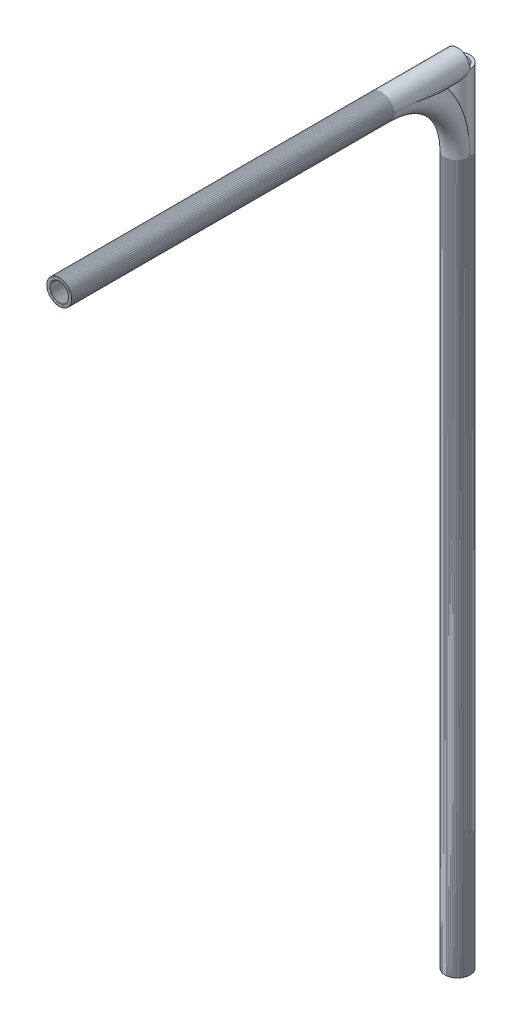
ISO-10303-21;
HEADER;
FILE_DESCRIPTION(('STEP AP214'),'2;1');
FILE_NAME('part.step','',(''),(''),'','','');
FILE_SCHEMA(('AUTOMOTIVE_DESIGN { 1 0 10303 214 1 1 1 1 }'));
ENDSEC;
DATA;
#1=APPLICATION_CONTEXT('core data for automotive mechanical design processes');
#2=APPLICATION_PROTOCOL_DEFINITION('international standard','automotive_design',2000,#1);
#3=PRODUCT_CONTEXT('',#1,'mechanical');
#4=PRODUCT('Part','Part','',(#3));
#5=PRODUCT_RELATED_PRODUCT_CATEGORY('part','',(#4));
#6=PRODUCT_DEFINITION_FORMATION('','',#4);
#7=PRODUCT_DEFINITION_CONTEXT('part definition',#1,'design');
#8=PRODUCT_DEFINITION('design','',#6,#7);
#9=PRODUCT_DEFINITION_SHAPE('','',#8);
#10=(LENGTH_UNIT() NAMED_UNIT(*) SI_UNIT(.MILLI.,.METRE.));
#11=(NAMED_UNIT(*) PLANE_ANGLE_UNIT() SI_UNIT($,.RADIAN.));
#12=(NAMED_UNIT(*) SI_UNIT($,.STERADIAN.) SOLID_ANGLE_UNIT());
#13=UNCERTAINTY_MEASURE_WITH_UNIT(LENGTH_MEASURE(1.E-05),#10,'distance_accuracy_value','');
#14=(GEOMETRIC_REPRESENTATION_CONTEXT(3) GLOBAL_UNCERTAINTY_ASSIGNED_CONTEXT((#13)) GLOBAL_UNIT_ASSIGNED_CONTEXT((#10,
#11,#12)) REPRESENTATION_CONTEXT('',''));
#15=CARTESIAN_POINT('',(0.,0.,0.));
#16=DIRECTION('',(0.,0.,1.));
#17=DIRECTION('',(1.,0.,0.));
#18=AXIS2_PLACEMENT_3D('',#15,#16,#17);
#19=CARTESIAN_POINT('',(0.,-256.,-150.));
#20=DIRECTION('',(0.,1.,0.));
#21=DIRECTION('',(0.,0.,1.));
#22=AXIS2_PLACEMENT_3D('',#19,#20,#21);
#23=PLANE('',#22);
#24=CARTESIAN_POINT('',(0.,-256.,-150.));
#25=DIRECTION('',(0.,1.,0.));
#26=DIRECTION('',(0.,0.,1.));
#27=AXIS2_PLACEMENT_3D('',#24,#25,#26);
#28=CIRCLE('',#27,3.065);
#29=CARTESIAN_POINT('',(0.,-256.,-146.935));
#30=VERTEX_POINT('',#29);
#31=EDGE_CURVE('E88',#30,#30,#28,.T.);
#32=ORIENTED_EDGE('',*,*,#31,.T.);
#33=EDGE_LOOP('',(#32));
#34=FACE_BOUND('',#33,.T.);
#35=CARTESIAN_POINT('',(0.,-256.,-150.));
#36=DIRECTION('',(0.,1.,0.));
#37=DIRECTION('',(0.,0.,1.));
#38=AXIS2_PLACEMENT_3D('',#35,#36,#37);
#39=CIRCLE('',#38,4.065);
#40=CARTESIAN_POINT('',(0.,-256.,-145.935));
#41=VERTEX_POINT('',#40);
#42=EDGE_CURVE('E80',#41,#41,#39,.T.);
#43=ORIENTED_EDGE('',*,*,#42,.F.);
#44=EDGE_LOOP('',(#43));
#45=FACE_BOUND('',#44,.T.);
#46=ADVANCED_FACE('F74',(#34,#45),#23,.F.);
#47=CARTESIAN_POINT('',(0.,0.,-150.));
#48=DIRECTION('',(0.,1.,0.));
#49=DIRECTION('',(0.,0.,1.));
#50=AXIS2_PLACEMENT_3D('',#47,#48,#49);
#51=PLANE('',#50);
#52=CARTESIAN_POINT('',(0.,0.,-150.));
#53=DIRECTION('',(0.,1.,0.));
#54=DIRECTION('',(0.,0.,1.));
#55=AXIS2_PLACEMENT_3D('',#52,#53,#54);
#56=CIRCLE('',#55,3.065);
#57=CARTESIAN_POINT('',(0.,0.,-146.935));
#58=VERTEX_POINT('',#57);
#59=EDGE_CURVE('E84',#58,#58,#56,.T.);
#60=ORIENTED_EDGE('',*,*,#59,.F.);
#61=EDGE_LOOP('',(#60));
#62=FACE_BOUND('',#61,.T.);
#63=CARTESIAN_POINT('',(0.,0.,-150.));
#64=DIRECTION('',(0.,1.,0.));
#65=DIRECTION('',(0.,0.,1.));
#66=AXIS2_PLACEMENT_3D('',#63,#64,#65);
#67=CIRCLE('',#66,4.065);
#68=CARTESIAN_POINT('',(0.,0.,-145.935));
#69=VERTEX_POINT('',#68);
#70=EDGE_CURVE('E12',#69,#69,#67,.T.);
#71=ORIENTED_EDGE('',*,*,#70,.T.);
#72=EDGE_LOOP('',(#71));
#73=FACE_BOUND('',#72,.T.);
#74=ADVANCED_FACE('F104',(#62,#73),#51,.T.);
#75=CARTESIAN_POINT('',(0.,-256.,-150.));
#76=DIRECTION('',(0.,1.,0.));
#77=DIRECTION('',(0.,0.,1.));
#78=AXIS2_PLACEMENT_3D('',#75,#76,#77);
#79=CYLINDRICAL_SURFACE('',#78,4.065);
#80=ORIENTED_EDGE('',*,*,#70,.F.);
#81=EDGE_LOOP('',(#80));
#82=FACE_BOUND('',#81,.T.);
#83=ORIENTED_EDGE('',*,*,#42,.T.);
#84=EDGE_LOOP('',(#83));
#85=FACE_BOUND('',#84,.T.);
#86=ADVANCED_FACE('F98',(#82,#85),#79,.T.);
#87=CARTESIAN_POINT('',(0.,-256.,-150.));
#88=DIRECTION('',(0.,1.,0.));
#89=DIRECTION('',(0.,0.,1.));
#90=AXIS2_PLACEMENT_3D('',#87,#88,#89);
#91=CYLINDRICAL_SURFACE('',#90,3.065);
#92=ORIENTED_EDGE('',*,*,#59,.T.);
#93=EDGE_LOOP('',(#92));
#94=FACE_BOUND('',#93,.T.);
#95=ORIENTED_EDGE('',*,*,#31,.F.);
#96=EDGE_LOOP('',(#95));
#97=FACE_BOUND('',#96,.T.);
#98=ADVANCED_FACE('F96',(#94,#97),#91,.F.);
#99=CLOSED_SHELL('',(#46,#74,#86,#98));
#100=MANIFOLD_SOLID_BREP('B2',#99);
#101=CARTESIAN_POINT('',(0.,0.,-20.));
#102=DIRECTION('',(0.,0.,-1.));
#103=DIRECTION('',(-1.,0.,0.));
#104=AXIS2_PLACEMENT_3D('',#101,#102,#103);
#105=PLANE('',#104);
#106=CARTESIAN_POINT('',(0.,0.,-20.));
#107=DIRECTION('',(0.,0.,-1.));
#108=DIRECTION('',(-1.,0.,0.));
#109=AXIS2_PLACEMENT_3D('',#106,#107,#108);
#110=CIRCLE('',#109,3.065);
#111=CARTESIAN_POINT('',(-3.065,0.,-20.));
#112=VERTEX_POINT('',#111);
#113=EDGE_CURVE('E157',#112,#112,#110,.T.);
#114=ORIENTED_EDGE('',*,*,#113,.T.);
#115=EDGE_LOOP('',(#114));
#116=FACE_BOUND('',#115,.T.);
#117=CARTESIAN_POINT('',(0.,0.,-20.));
#118=DIRECTION('',(0.,0.,-1.));
#119=DIRECTION('',(-1.,0.,0.));
#120=AXIS2_PLACEMENT_3D('',#117,#118,#119);
#121=CIRCLE('',#120,4.065);
#122=CARTESIAN_POINT('',(-4.065,0.,-20.));
#123=VERTEX_POINT('',#122);
#124=EDGE_CURVE('E149',#123,#123,#121,.T.);
#125=ORIENTED_EDGE('',*,*,#124,.F.);
#126=EDGE_LOOP('',(#125));
#127=FACE_BOUND('',#126,.T.);
#128=ADVANCED_FACE('F143',(#116,#127),#105,.F.);
#129=CARTESIAN_POINT('',(0.,0.,-150.));
#130=DIRECTION('',(0.,0.,-1.));
#131=DIRECTION('',(-1.,0.,0.));
#132=AXIS2_PLACEMENT_3D('',#129,#130,#131);
#133=PLANE('',#132);
#134=CARTESIAN_POINT('',(0.,0.,-150.));
#135=DIRECTION('',(0.,0.,-1.));
#136=DIRECTION('',(-1.,0.,0.));
#137=AXIS2_PLACEMENT_3D('',#134,#135,#136);
#138=CIRCLE('',#137,3.065);
#139=CARTESIAN_POINT('',(-3.065,0.,-150.));
#140=VERTEX_POINT('',#139);
#141=EDGE_CURVE('E153',#140,#140,#138,.T.);
#142=ORIENTED_EDGE('',*,*,#141,.F.);
#143=EDGE_LOOP('',(#142));
#144=FACE_BOUND('',#143,.T.);
#145=CARTESIAN_POINT('',(0.,0.,-150.));
#146=DIRECTION('',(0.,0.,-1.));
#147=DIRECTION('',(-1.,0.,0.));
#148=AXIS2_PLACEMENT_3D('',#145,#146,#147);
#149=CIRCLE('',#148,4.065);
#150=CARTESIAN_POINT('',(-4.065,0.,-150.));
#151=VERTEX_POINT('',#150);
#152=EDGE_CURVE('E73',#151,#151,#149,.T.);
#153=ORIENTED_EDGE('',*,*,#152,.T.);
#154=EDGE_LOOP('',(#153));
#155=FACE_BOUND('',#154,.T.);
#156=ADVANCED_FACE('F173',(#144,#155),#133,.T.);
#157=CARTESIAN_POINT('',(0.,0.,-20.));
#158=DIRECTION('',(0.,0.,-1.));
#159=DIRECTION('',(-1.,0.,0.));
#160=AXIS2_PLACEMENT_3D('',#157,#158,#159);
#161=CYLINDRICAL_SURFACE('',#160,4.065);
#162=ORIENTED_EDGE('',*,*,#152,.F.);
#163=EDGE_LOOP('',(#162));
#164=FACE_BOUND('',#163,.T.);
#165=ORIENTED_EDGE('',*,*,#124,.T.);
#166=EDGE_LOOP('',(#165));
#167=FACE_BOUND('',#166,.T.);
#168=ADVANCED_FACE('F167',(#164,#167),#161,.T.);
#169=CARTESIAN_POINT('',(0.,0.,-20.));
#170=DIRECTION('',(0.,0.,-1.));
#171=DIRECTION('',(-1.,0.,0.));
#172=AXIS2_PLACEMENT_3D('',#169,#170,#171);
#173=CYLINDRICAL_SURFACE('',#172,3.065);
#174=ORIENTED_EDGE('',*,*,#141,.T.);
#175=EDGE_LOOP('',(#174));
#176=FACE_BOUND('',#175,.T.);
#177=ORIENTED_EDGE('',*,*,#113,.F.);
#178=EDGE_LOOP('',(#177));
#179=FACE_BOUND('',#178,.T.);
#180=ADVANCED_FACE('F165',(#176,#179),#173,.F.);
#181=CLOSED_SHELL('',(#128,#156,#168,#180));
#182=MANIFOLD_SOLID_BREP('B7',#181);
#183=CARTESIAN_POINT('',(0.,0.,-20.));
#184=DIRECTION('',(0.,0.,1.));
#185=DIRECTION('',(0.,-1.,0.));
#186=AXIS2_PLACEMENT_3D('',#183,#184,#185);
#187=PLANE('',#186);
#188=CARTESIAN_POINT('',(0.,0.,-20.));
#189=DIRECTION('',(0.,0.,1.));
#190=DIRECTION('',(0.,-1.,0.));
#191=AXIS2_PLACEMENT_3D('',#188,#189,#190);
#192=CIRCLE('',#191,3.065);
#193=CARTESIAN_POINT('',(0.,-3.065,-20.));
#194=VERTEX_POINT('',#193);
#195=EDGE_CURVE('E228',#194,#194,#192,.T.);
#196=ORIENTED_EDGE('',*,*,#195,.F.);
#197=EDGE_LOOP('',(#196));
#198=FACE_BOUND('',#197,.T.);
#199=CARTESIAN_POINT('',(0.,0.,-20.));
#200=DIRECTION('',(0.,0.,1.));
#201=DIRECTION('',(0.,-1.,0.));
#202=AXIS2_PLACEMENT_3D('',#199,#200,#201);
#203=CIRCLE('',#202,4.065);
#204=CARTESIAN_POINT('',(0.,-4.065,-20.));
#205=VERTEX_POINT('',#204);
#206=EDGE_CURVE('E219',#205,#205,#203,.T.);
#207=ORIENTED_EDGE('',*,*,#206,.T.);
#208=EDGE_LOOP('',(#207));
#209=FACE_BOUND('',#208,.T.);
#210=ADVANCED_FACE('F205',(#198,#209),#187,.T.);
#211=CARTESIAN_POINT('',(0.,-256.,-150.));
#212=DIRECTION('',(0.,1.,0.));
#213=DIRECTION('',(0.,0.,1.));
#214=AXIS2_PLACEMENT_3D('',#211,#212,#213);
#215=PLANE('',#214);
#216=CARTESIAN_POINT('',(0.,-256.,-150.));
#217=DIRECTION('',(0.,1.,0.));
#218=DIRECTION('',(0.,0.,1.));
#219=AXIS2_PLACEMENT_3D('',#216,#217,#218);
#220=CIRCLE('',#219,3.065);
#221=CARTESIAN_POINT('',(0.,-256.,-146.935));
#222=VERTEX_POINT('',#221);
#223=EDGE_CURVE('E224',#222,#222,#220,.T.);
#224=ORIENTED_EDGE('',*,*,#223,.T.);
#225=EDGE_LOOP('',(#224));
#226=FACE_BOUND('',#225,.T.);
#227=CARTESIAN_POINT('',(0.,-256.,-150.));
#228=DIRECTION('',(0.,1.,0.));
#229=DIRECTION('',(0.,0.,1.));
#230=AXIS2_PLACEMENT_3D('',#227,#228,#229);
#231=CIRCLE('',#230,4.065);
#232=CARTESIAN_POINT('',(0.,-256.,-145.935));
#233=VERTEX_POINT('',#232);
#234=EDGE_CURVE('E142',#233,#233,#231,.T.);
#235=ORIENTED_EDGE('',*,*,#234,.F.);
#236=EDGE_LOOP('',(#235));
#237=FACE_BOUND('',#236,.T.);
#238=ADVANCED_FACE('F248',(#226,#237),#215,.F.);
#239=CARTESIAN_POINT('',(0.,0.,-20.));
#240=DIRECTION('',(0.,0.,-1.));
#241=DIRECTION('',(-1.,0.,0.));
#242=AXIS2_PLACEMENT_3D('',#239,#240,#241);
#243=CYLINDRICAL_SURFACE('',#242,4.065);
#244=CARTESIAN_POINT('',(0.,0.,-125.));
#245=DIRECTION('',(0.,0.,1.));
#246=DIRECTION('',(0.,-1.,0.));
#247=AXIS2_PLACEMENT_3D('',#244,#245,#246);
#248=CIRCLE('',#247,4.065);
#249=CARTESIAN_POINT('',(0.,4.065,-125.));
#250=VERTEX_POINT('',#249);
#251=EDGE_CURVE('E215',#250,#250,#248,.T.);
#252=ORIENTED_EDGE('',*,*,#251,.T.);
#253=EDGE_LOOP('',(#252));
#254=FACE_BOUND('',#253,.T.);
#255=ORIENTED_EDGE('',*,*,#206,.F.);
#256=EDGE_LOOP('',(#255));
#257=FACE_BOUND('',#256,.T.);
#258=ADVANCED_FACE('F252',(#254,#257),#243,.T.);
#259=CARTESIAN_POINT('',(0.,-25.,-125.));
#260=DIRECTION('',(-1.,0.,0.));
#261=DIRECTION('',(0.,0.,1.));
#262=AXIS2_PLACEMENT_3D('',#259,#260,#261);
#263=TOROIDAL_SURFACE('',#262,25.,4.065);
#264=CARTESIAN_POINT('',(0.,-25.,-150.));
#265=DIRECTION('',(0.,1.,0.));
#266=DIRECTION('',(0.,0.,1.));
#267=AXIS2_PLACEMENT_3D('',#264,#265,#266);
#268=CIRCLE('',#267,4.065);
#269=CARTESIAN_POINT('',(0.,-25.,-154.065));
#270=VERTEX_POINT('',#269);
#271=EDGE_CURVE('E211',#270,#270,#268,.T.);
#272=CARTESIAN_POINT('',(0.,-25.,-125.));
#273=DIRECTION('',(-1.,0.,0.));
#274=DIRECTION('',(0.,0.,1.));
#275=AXIS2_PLACEMENT_3D('',#272,#273,#274);
#276=CIRCLE('',#275,29.065);
#277=EDGE_CURVE('',#250,#270,#276,.T.);
#278=ORIENTED_EDGE('',*,*,#251,.F.);
#279=ORIENTED_EDGE('',*,*,#271,.T.);
#280=ORIENTED_EDGE('',*,*,#277,.T.);
#281=ORIENTED_EDGE('',*,*,#277,.F.);
#282=EDGE_LOOP('',(#278,#280,#279,#281));
#283=FACE_BOUND('',#282,.T.);
#284=ADVANCED_FACE('F254',(#283),#263,.T.);
#285=CARTESIAN_POINT('',(0.,-25.,-150.));
#286=DIRECTION('',(0.,-1.,0.));
#287=DIRECTION('',(0.,0.,-1.));
#288=AXIS2_PLACEMENT_3D('',#285,#286,#287);
#289=CYLINDRICAL_SURFACE('',#288,4.065);
#290=ORIENTED_EDGE('',*,*,#234,.T.);
#291=EDGE_LOOP('',(#290));
#292=FACE_BOUND('',#291,.T.);
#293=ORIENTED_EDGE('',*,*,#271,.F.);
#294=EDGE_LOOP('',(#293));
#295=FACE_BOUND('',#294,.T.);
#296=ADVANCED_FACE('F242',(#292,#295),#289,.T.);
#297=CARTESIAN_POINT('',(0.,0.,-20.));
#298=DIRECTION('',(0.,0.,-1.));
#299=DIRECTION('',(-1.,0.,0.));
#300=AXIS2_PLACEMENT_3D('',#297,#298,#299);
#301=CYLINDRICAL_SURFACE('',#300,3.065);
#302=CARTESIAN_POINT('',(0.,0.,-125.));
#303=DIRECTION('',(0.,0.,-1.));
#304=DIRECTION('',(-1.,0.,0.));
#305=AXIS2_PLACEMENT_3D('',#302,#303,#304);
#306=CIRCLE('',#305,3.065);
#307=CARTESIAN_POINT('',(0.,3.065,-125.));
#308=VERTEX_POINT('',#307);
#309=EDGE_CURVE('E231',#308,#308,#306,.F.);
#310=ORIENTED_EDGE('',*,*,#309,.F.);
#311=EDGE_LOOP('',(#310));
#312=FACE_BOUND('',#311,.T.);
#313=ORIENTED_EDGE('',*,*,#195,.T.);
#314=EDGE_LOOP('',(#313));
#315=FACE_BOUND('',#314,.T.);
#316=ADVANCED_FACE('F239',(#312,#315),#301,.F.);
#317=CARTESIAN_POINT('',(0.,-25.,-125.));
#318=DIRECTION('',(-1.,0.,0.));
#319=DIRECTION('',(0.,0.,1.));
#320=AXIS2_PLACEMENT_3D('',#317,#318,#319);
#321=TOROIDAL_SURFACE('',#320,25.,3.065);
#322=CARTESIAN_POINT('',(0.,-25.,-150.));
#323=DIRECTION('',(0.,1.,0.));
#324=DIRECTION('',(0.,0.,1.));
#325=AXIS2_PLACEMENT_3D('',#322,#323,#324);
#326=CIRCLE('',#325,3.065);
#327=CARTESIAN_POINT('',(0.,-25.,-153.065));
#328=VERTEX_POINT('',#327);
#329=EDGE_CURVE('E227',#328,#328,#326,.T.);
#330=CARTESIAN_POINT('',(0.,-25.,-125.));
#331=DIRECTION('',(-1.,0.,0.));
#332=DIRECTION('',(0.,0.,1.));
#333=AXIS2_PLACEMENT_3D('',#330,#331,#332);
#334=CIRCLE('',#333,28.065);
#335=EDGE_CURVE('',#308,#328,#334,.T.);
#336=ORIENTED_EDGE('',*,*,#309,.T.);
#337=ORIENTED_EDGE('',*,*,#329,.F.);
#338=ORIENTED_EDGE('',*,*,#335,.T.);
#339=ORIENTED_EDGE('',*,*,#335,.F.);
#340=EDGE_LOOP('',(#336,#338,#337,#339));
#341=FACE_BOUND('',#340,.T.);
#342=ADVANCED_FACE('F237',(#341),#321,.F.);
#343=CARTESIAN_POINT('',(0.,-25.,-150.));
#344=DIRECTION('',(0.,-1.,0.));
#345=DIRECTION('',(0.,0.,-1.));
#346=AXIS2_PLACEMENT_3D('',#343,#344,#345);
#347=CYLINDRICAL_SURFACE('',#346,3.065);
#348=ORIENTED_EDGE('',*,*,#223,.F.);
#349=EDGE_LOOP('',(#348));
#350=FACE_BOUND('',#349,.T.);
#351=ORIENTED_EDGE('',*,*,#329,.T.);
#352=EDGE_LOOP('',(#351));
#353=FACE_BOUND('',#352,.T.);
#354=ADVANCED_FACE('F249',(#350,#353),#347,.F.);
#355=CLOSED_SHELL('',(#210,#238,#258,#284,#296,#316,#342,#354));
#356=MANIFOLD_SOLID_BREP('B68',#355);
#357=ADVANCED_BREP_SHAPE_REPRESENTATION('',(#18,#100,#182,#356),#14);
#358=SHAPE_DEFINITION_REPRESENTATION(#9,#357);
ENDSEC;
END-ISO-10303-21;
